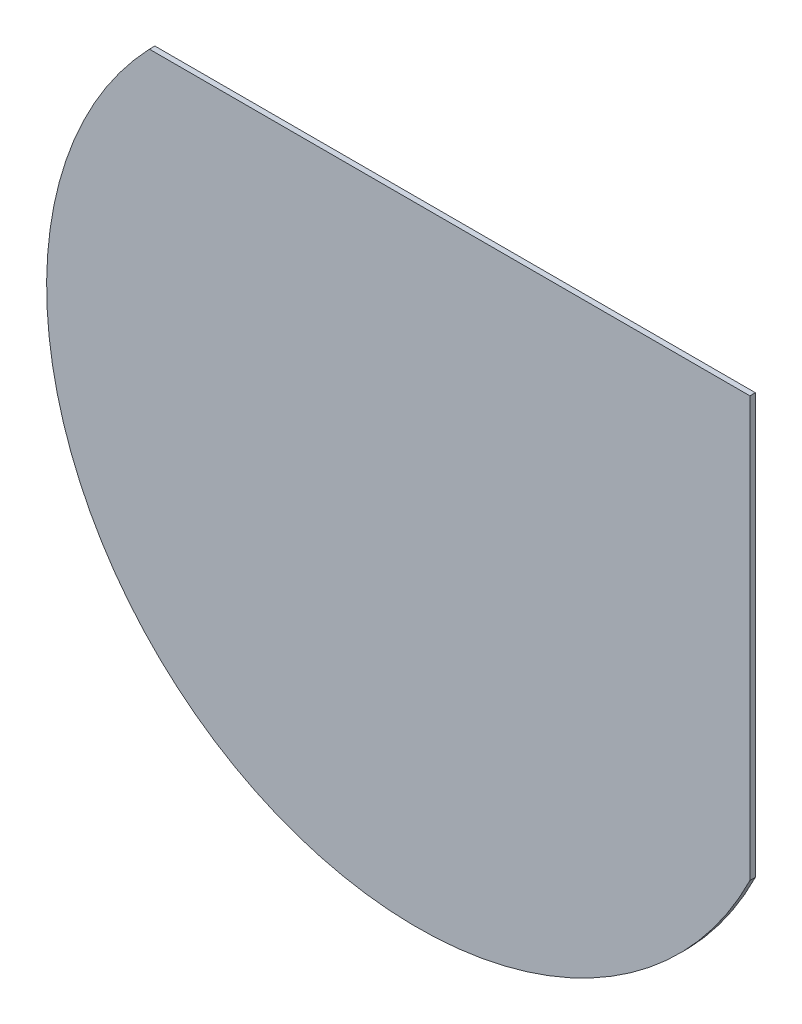
ISO-10303-21;
HEADER;
FILE_DESCRIPTION(('STEP AP214'),'2;1');
FILE_NAME('part.step','',(''),(''),'','','');
FILE_SCHEMA(('AUTOMOTIVE_DESIGN { 1 0 10303 214 1 1 1 1 }'));
ENDSEC;
DATA;
#1=APPLICATION_CONTEXT('core data for automotive mechanical design processes');
#2=APPLICATION_PROTOCOL_DEFINITION('international standard','automotive_design',2000,#1);
#3=PRODUCT_CONTEXT('',#1,'mechanical');
#4=PRODUCT('Part','Part','',(#3));
#5=PRODUCT_RELATED_PRODUCT_CATEGORY('part','',(#4));
#6=PRODUCT_DEFINITION_FORMATION('','',#4);
#7=PRODUCT_DEFINITION_CONTEXT('part definition',#1,'design');
#8=PRODUCT_DEFINITION('design','',#6,#7);
#9=PRODUCT_DEFINITION_SHAPE('','',#8);
#10=(LENGTH_UNIT() NAMED_UNIT(*) SI_UNIT(.MILLI.,.METRE.));
#11=(NAMED_UNIT(*) PLANE_ANGLE_UNIT() SI_UNIT($,.RADIAN.));
#12=(NAMED_UNIT(*) SI_UNIT($,.STERADIAN.) SOLID_ANGLE_UNIT());
#13=UNCERTAINTY_MEASURE_WITH_UNIT(LENGTH_MEASURE(1.E-05),#10,'distance_accuracy_value','');
#14=(GEOMETRIC_REPRESENTATION_CONTEXT(3) GLOBAL_UNCERTAINTY_ASSIGNED_CONTEXT((#13)) GLOBAL_UNIT_ASSIGNED_CONTEXT((#10,
#11,#12)) REPRESENTATION_CONTEXT('',''));
#15=CARTESIAN_POINT('',(0.,0.,0.));
#16=DIRECTION('',(0.,0.,1.));
#17=DIRECTION('',(1.,0.,0.));
#18=AXIS2_PLACEMENT_3D('',#15,#16,#17);
#19=CARTESIAN_POINT('',(61.0245852095694,47.,-1.));
#20=DIRECTION('',(0.,1.,0.));
#21=DIRECTION('',(-1.,0.,0.));
#22=AXIS2_PLACEMENT_3D('',#19,#20,#21);
#23=PLANE('',#22);
#24=DIRECTION('',(-1.,0.,0.));
#25=VECTOR('',#24,1.);
#26=CARTESIAN_POINT('',(61.0245852095694,47.,0.));
#27=LINE('',#26,#25);
#28=CARTESIAN_POINT('',(61.0245852095694,47.,0.));
#29=VERTEX_POINT('',#28);
#30=CARTESIAN_POINT('',(-49.1426495012225,47.,0.));
#31=VERTEX_POINT('',#30);
#32=EDGE_CURVE('E90',#29,#31,#27,.T.);
#33=ORIENTED_EDGE('',*,*,#32,.F.);
#34=DIRECTION('',(0.,0.,1.));
#35=VECTOR('',#34,1.);
#36=CARTESIAN_POINT('',(61.0245852095694,47.,-1.));
#37=LINE('',#36,#35);
#38=CARTESIAN_POINT('',(61.0245852095694,47.,-1.));
#39=VERTEX_POINT('',#38);
#40=EDGE_CURVE('E11',#39,#29,#37,.T.);
#41=ORIENTED_EDGE('',*,*,#40,.F.);
#42=DIRECTION('',(-1.,0.,0.));
#43=VECTOR('',#42,1.);
#44=CARTESIAN_POINT('',(61.0245852095694,47.,-1.));
#45=LINE('',#44,#43);
#46=CARTESIAN_POINT('',(-49.1426495012225,47.,-1.));
#47=VERTEX_POINT('',#46);
#48=EDGE_CURVE('E82',#39,#47,#45,.T.);
#49=ORIENTED_EDGE('',*,*,#48,.T.);
#50=DIRECTION('',(0.,0.,1.));
#51=VECTOR('',#50,1.);
#52=CARTESIAN_POINT('',(-49.1426495012225,47.,-1.));
#53=LINE('',#52,#51);
#54=EDGE_CURVE('E41',#47,#31,#53,.T.);
#55=ORIENTED_EDGE('',*,*,#54,.T.);
#56=EDGE_LOOP('',(#33,#41,#49,#55));
#57=FACE_BOUND('',#56,.T.);
#58=ADVANCED_FACE('F38',(#57),#23,.T.);
#59=CARTESIAN_POINT('',(61.0245852095694,47.,-1.));
#60=DIRECTION('',(1.,0.,0.));
#61=DIRECTION('',(0.,1.,0.));
#62=AXIS2_PLACEMENT_3D('',#59,#60,#61);
#63=PLANE('',#62);
#64=DIRECTION('',(0.,1.,0.));
#65=VECTOR('',#64,1.);
#66=CARTESIAN_POINT('',(61.0245852095694,47.,0.));
#67=LINE('',#66,#65);
#68=CARTESIAN_POINT('',(61.0245852095694,-30.,0.));
#69=VERTEX_POINT('',#68);
#70=EDGE_CURVE('E84',#69,#29,#67,.T.);
#71=ORIENTED_EDGE('',*,*,#70,.F.);
#72=DIRECTION('',(0.,0.,1.));
#73=VECTOR('',#72,1.);
#74=CARTESIAN_POINT('',(61.0245852095694,-30.,-1.));
#75=LINE('',#74,#73);
#76=CARTESIAN_POINT('',(61.0245852095694,-30.,-1.));
#77=VERTEX_POINT('',#76);
#78=EDGE_CURVE('E47',#77,#69,#75,.T.);
#79=ORIENTED_EDGE('',*,*,#78,.F.);
#80=DIRECTION('',(0.,1.,0.));
#81=VECTOR('',#80,1.);
#82=CARTESIAN_POINT('',(61.0245852095694,47.,-1.));
#83=LINE('',#82,#81);
#84=EDGE_CURVE('E79',#77,#39,#83,.T.);
#85=ORIENTED_EDGE('',*,*,#84,.T.);
#86=ORIENTED_EDGE('',*,*,#40,.T.);
#87=EDGE_LOOP('',(#71,#79,#85,#86));
#88=FACE_BOUND('',#87,.T.);
#89=ADVANCED_FACE('F94',(#88),#63,.T.);
#90=CARTESIAN_POINT('',(0.,0.,-1.));
#91=DIRECTION('',(0.,0.,1.));
#92=DIRECTION('',(1.,0.,0.));
#93=AXIS2_PLACEMENT_3D('',#90,#91,#92);
#94=CYLINDRICAL_SURFACE('',#93,68.);
#95=CARTESIAN_POINT('',(0.,0.,0.));
#96=DIRECTION('',(0.,0.,1.));
#97=DIRECTION('',(1.,0.,0.));
#98=AXIS2_PLACEMENT_3D('',#95,#96,#97);
#99=CIRCLE('',#98,68.);
#100=EDGE_CURVE('E77',#31,#69,#99,.T.);
#101=ORIENTED_EDGE('',*,*,#100,.F.);
#102=ORIENTED_EDGE('',*,*,#54,.F.);
#103=CARTESIAN_POINT('',(0.,0.,-1.));
#104=DIRECTION('',(0.,0.,1.));
#105=DIRECTION('',(1.,0.,0.));
#106=AXIS2_PLACEMENT_3D('',#103,#104,#105);
#107=CIRCLE('',#106,68.);
#108=EDGE_CURVE('E75',#47,#77,#107,.T.);
#109=ORIENTED_EDGE('',*,*,#108,.T.);
#110=ORIENTED_EDGE('',*,*,#78,.T.);
#111=EDGE_LOOP('',(#101,#102,#109,#110));
#112=FACE_BOUND('',#111,.T.);
#113=ADVANCED_FACE('F74',(#112),#94,.T.);
#114=CARTESIAN_POINT('',(0.,0.,-1.));
#115=DIRECTION('',(0.,0.,1.));
#116=DIRECTION('',(1.,0.,0.));
#117=AXIS2_PLACEMENT_3D('',#114,#115,#116);
#118=PLANE('',#117);
#119=ORIENTED_EDGE('',*,*,#48,.F.);
#120=ORIENTED_EDGE('',*,*,#84,.F.);
#121=ORIENTED_EDGE('',*,*,#108,.F.);
#122=EDGE_LOOP('',(#119,#120,#121));
#123=FACE_BOUND('',#122,.T.);
#124=ADVANCED_FACE('F81',(#123),#118,.F.);
#125=CARTESIAN_POINT('',(0.,0.,0.));
#126=DIRECTION('',(0.,0.,1.));
#127=DIRECTION('',(1.,0.,0.));
#128=AXIS2_PLACEMENT_3D('',#125,#126,#127);
#129=PLANE('',#128);
#130=ORIENTED_EDGE('',*,*,#32,.T.);
#131=ORIENTED_EDGE('',*,*,#100,.T.);
#132=ORIENTED_EDGE('',*,*,#70,.T.);
#133=EDGE_LOOP('',(#130,#131,#132));
#134=FACE_BOUND('',#133,.T.);
#135=ADVANCED_FACE('F93',(#134),#129,.T.);
#136=CLOSED_SHELL('',(#58,#89,#113,#124,#135));
#137=MANIFOLD_SOLID_BREP('B2',#136);
#138=ADVANCED_BREP_SHAPE_REPRESENTATION('',(#18,#137),#14);
#139=SHAPE_DEFINITION_REPRESENTATION(#9,#138);
ENDSEC;
END-ISO-10303-21;
